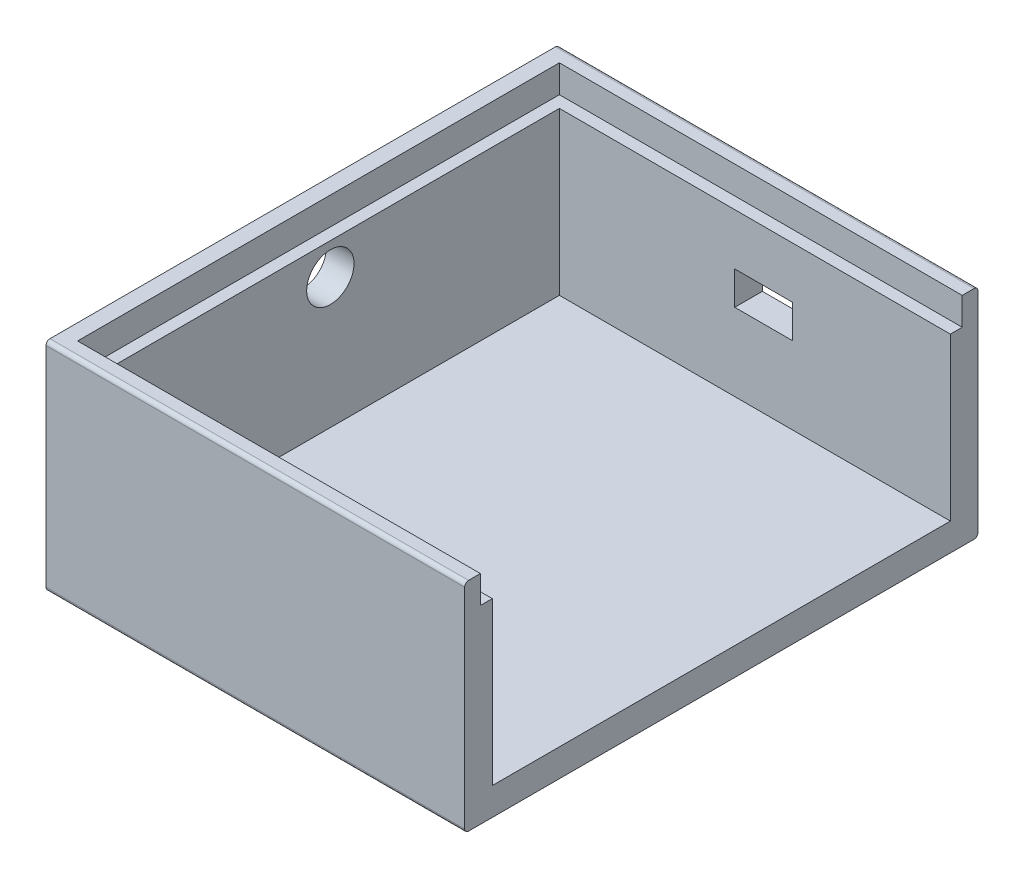
ISO-10303-21;
HEADER;
FILE_DESCRIPTION(('STEP AP214'),'2;1');
FILE_NAME('part.step','',(''),(''),'','','');
FILE_SCHEMA(('AUTOMOTIVE_DESIGN { 1 0 10303 214 1 1 1 1 }'));
ENDSEC;
DATA;
#1=APPLICATION_CONTEXT('core data for automotive mechanical design processes');
#2=APPLICATION_PROTOCOL_DEFINITION('international standard','automotive_design',2000,#1);
#3=PRODUCT_CONTEXT('',#1,'mechanical');
#4=PRODUCT('Part','Part','',(#3));
#5=PRODUCT_RELATED_PRODUCT_CATEGORY('part','',(#4));
#6=PRODUCT_DEFINITION_FORMATION('','',#4);
#7=PRODUCT_DEFINITION_CONTEXT('part definition',#1,'design');
#8=PRODUCT_DEFINITION('design','',#6,#7);
#9=PRODUCT_DEFINITION_SHAPE('','',#8);
#10=(LENGTH_UNIT() NAMED_UNIT(*) SI_UNIT(.MILLI.,.METRE.));
#11=(NAMED_UNIT(*) PLANE_ANGLE_UNIT() SI_UNIT($,.RADIAN.));
#12=(NAMED_UNIT(*) SI_UNIT($,.STERADIAN.) SOLID_ANGLE_UNIT());
#13=UNCERTAINTY_MEASURE_WITH_UNIT(LENGTH_MEASURE(1.E-05),#10,'distance_accuracy_value','');
#14=(GEOMETRIC_REPRESENTATION_CONTEXT(3) GLOBAL_UNCERTAINTY_ASSIGNED_CONTEXT((#13)) GLOBAL_UNIT_ASSIGNED_CONTEXT((#10,
#11,#12)) REPRESENTATION_CONTEXT('',''));
#15=CARTESIAN_POINT('',(0.,0.,0.));
#16=DIRECTION('',(0.,0.,1.));
#17=DIRECTION('',(1.,0.,0.));
#18=AXIS2_PLACEMENT_3D('',#15,#16,#17);
#19=CARTESIAN_POINT('',(106.,0.,1.));
#20=DIRECTION('',(0.,-1.,0.));
#21=DIRECTION('',(0.,0.,-1.));
#22=AXIS2_PLACEMENT_3D('',#19,#20,#21);
#23=PLANE('',#22);
#24=DIRECTION('',(0.,0.,-1.));
#25=VECTOR('',#24,1.);
#26=CARTESIAN_POINT('',(4.,0.,1.));
#27=LINE('',#26,#25);
#28=CARTESIAN_POINT('',(4.,0.,126.));
#29=VERTEX_POINT('',#28);
#30=CARTESIAN_POINT('',(4.,0.,4.));
#31=VERTEX_POINT('',#30);
#32=EDGE_CURVE('E12',#29,#31,#27,.T.);
#33=ORIENTED_EDGE('',*,*,#32,.T.);
#34=DIRECTION('',(1.,0.,0.));
#35=VECTOR('',#34,1.);
#36=CARTESIAN_POINT('',(106.,0.,4.));
#37=LINE('',#36,#35);
#38=CARTESIAN_POINT('',(106.,0.,4.));
#39=VERTEX_POINT('',#38);
#40=EDGE_CURVE('E205',#31,#39,#37,.T.);
#41=ORIENTED_EDGE('',*,*,#40,.T.);
#42=DIRECTION('',(0.,0.,1.));
#43=VECTOR('',#42,1.);
#44=CARTESIAN_POINT('',(106.,0.,1.));
#45=LINE('',#44,#43);
#46=CARTESIAN_POINT('',(106.,0.,1.));
#47=VERTEX_POINT('',#46);
#48=EDGE_CURVE('E279',#47,#39,#45,.T.);
#49=ORIENTED_EDGE('',*,*,#48,.F.);
#50=DIRECTION('',(-1.,0.,0.));
#51=VECTOR('',#50,1.);
#52=CARTESIAN_POINT('',(106.,0.,1.));
#53=LINE('',#52,#51);
#54=CARTESIAN_POINT('',(0.,0.,1.));
#55=VERTEX_POINT('',#54);
#56=EDGE_CURVE('E330',#47,#55,#53,.T.);
#57=ORIENTED_EDGE('',*,*,#56,.T.);
#58=DIRECTION('',(0.,0.,1.));
#59=VECTOR('',#58,1.);
#60=CARTESIAN_POINT('',(0.,0.,1.));
#61=LINE('',#60,#59);
#62=CARTESIAN_POINT('',(0.,0.,129.));
#63=VERTEX_POINT('',#62);
#64=EDGE_CURVE('E297',#55,#63,#61,.T.);
#65=ORIENTED_EDGE('',*,*,#64,.T.);
#66=DIRECTION('',(-1.,0.,0.));
#67=VECTOR('',#66,1.);
#68=CARTESIAN_POINT('',(106.,0.,129.));
#69=LINE('',#68,#67);
#70=CARTESIAN_POINT('',(106.,0.,129.));
#71=VERTEX_POINT('',#70);
#72=EDGE_CURVE('E327',#71,#63,#69,.T.);
#73=ORIENTED_EDGE('',*,*,#72,.F.);
#74=CARTESIAN_POINT('',(106.,0.,126.));
#75=VERTEX_POINT('',#74);
#76=EDGE_CURVE('E277',#75,#71,#45,.T.);
#77=ORIENTED_EDGE('',*,*,#76,.F.);
#78=DIRECTION('',(-1.,0.,0.));
#79=VECTOR('',#78,1.);
#80=CARTESIAN_POINT('',(106.,0.,126.));
#81=LINE('',#80,#79);
#82=EDGE_CURVE('E203',#75,#29,#81,.T.);
#83=ORIENTED_EDGE('',*,*,#82,.T.);
#84=EDGE_LOOP('',(#33,#41,#49,#57,#65,#73,#77,#83));
#85=FACE_BOUND('',#84,.T.);
#86=ADVANCED_FACE('F36',(#85),#23,.F.);
#87=CARTESIAN_POINT('',(106.,-0.999999999999999,1.));
#88=DIRECTION('',(-1.,0.,0.));
#89=DIRECTION('',(0.,0.,1.));
#90=AXIS2_PLACEMENT_3D('',#87,#88,#89);
#91=PLANE('',#90);
#92=ORIENTED_EDGE('',*,*,#48,.T.);
#93=DIRECTION('',(0.,-1.,0.));
#94=VECTOR('',#93,1.);
#95=CARTESIAN_POINT('',(106.,-1.,4.));
#96=LINE('',#95,#94);
#97=CARTESIAN_POINT('',(106.,-7.,4.));
#98=VERTEX_POINT('',#97);
#99=EDGE_CURVE('E44',#39,#98,#96,.T.);
#100=ORIENTED_EDGE('',*,*,#99,.T.);
#101=DIRECTION('',(0.,0.,1.));
#102=VECTOR('',#101,1.);
#103=CARTESIAN_POINT('',(106.,-7.,1.));
#104=LINE('',#103,#102);
#105=CARTESIAN_POINT('',(106.,-7.,7.));
#106=VERTEX_POINT('',#105);
#107=EDGE_CURVE('E202',#98,#106,#104,.T.);
#108=ORIENTED_EDGE('',*,*,#107,.T.);
#109=DIRECTION('',(0.,1.,0.));
#110=VECTOR('',#109,1.);
#111=CARTESIAN_POINT('',(106.,-1.,7.));
#112=LINE('',#111,#110);
#113=CARTESIAN_POINT('',(106.,-48.,6.99999999999999));
#114=VERTEX_POINT('',#113);
#115=EDGE_CURVE('E264',#114,#106,#112,.T.);
#116=ORIENTED_EDGE('',*,*,#115,.F.);
#117=DIRECTION('',(0.,0.,-1.));
#118=VECTOR('',#117,1.);
#119=CARTESIAN_POINT('',(106.,-48.,0.99999999999999));
#120=LINE('',#119,#118);
#121=CARTESIAN_POINT('',(106.,-48.,123.));
#122=VERTEX_POINT('',#121);
#123=EDGE_CURVE('E270',#122,#114,#120,.T.);
#124=ORIENTED_EDGE('',*,*,#123,.F.);
#125=DIRECTION('',(0.,-1.,0.));
#126=VECTOR('',#125,1.);
#127=CARTESIAN_POINT('',(106.,-1.00000000000006,123.));
#128=LINE('',#127,#126);
#129=CARTESIAN_POINT('',(106.,-7.00000000000001,123.));
#130=VERTEX_POINT('',#129);
#131=EDGE_CURVE('E267',#130,#122,#128,.T.);
#132=ORIENTED_EDGE('',*,*,#131,.F.);
#133=CARTESIAN_POINT('',(106.,-7.00000000000002,126.));
#134=VERTEX_POINT('',#133);
#135=EDGE_CURVE('E199',#130,#134,#104,.T.);
#136=ORIENTED_EDGE('',*,*,#135,.T.);
#137=DIRECTION('',(0.,1.,0.));
#138=VECTOR('',#137,1.);
#139=CARTESIAN_POINT('',(106.,-1.00000000000001,126.));
#140=LINE('',#139,#138);
#141=EDGE_CURVE('E190',#134,#75,#140,.T.);
#142=ORIENTED_EDGE('',*,*,#141,.T.);
#143=ORIENTED_EDGE('',*,*,#76,.T.);
#144=CARTESIAN_POINT('',(106.,-1.00000000000001,129.));
#145=DIRECTION('',(1.,0.,0.));
#146=DIRECTION('',(0.,0.,-1.));
#147=AXIS2_PLACEMENT_3D('',#144,#145,#146);
#148=CIRCLE('',#147,1.);
#149=CARTESIAN_POINT('',(106.,-1.00000000000001,130.));
#150=VERTEX_POINT('',#149);
#151=EDGE_CURVE('E282',#71,#150,#148,.T.);
#152=ORIENTED_EDGE('',*,*,#151,.T.);
#153=DIRECTION('',(0.,-1.,0.));
#154=VECTOR('',#153,1.);
#155=CARTESIAN_POINT('',(106.,-1.00000000000001,130.));
#156=LINE('',#155,#154);
#157=CARTESIAN_POINT('',(106.,-54.,130.));
#158=VERTEX_POINT('',#157);
#159=EDGE_CURVE('E284',#150,#158,#156,.T.);
#160=ORIENTED_EDGE('',*,*,#159,.T.);
#161=CARTESIAN_POINT('',(106.,-54.,129.));
#162=DIRECTION('',(1.,0.,0.));
#163=DIRECTION('',(0.,0.,1.));
#164=AXIS2_PLACEMENT_3D('',#161,#162,#163);
#165=CIRCLE('',#164,0.99999999999999);
#166=CARTESIAN_POINT('',(106.,-55.,129.));
#167=VERTEX_POINT('',#166);
#168=EDGE_CURVE('E286',#158,#167,#165,.T.);
#169=ORIENTED_EDGE('',*,*,#168,.T.);
#170=DIRECTION('',(0.,0.,-1.));
#171=VECTOR('',#170,1.);
#172=CARTESIAN_POINT('',(106.,-55.,0.999999999999996));
#173=LINE('',#172,#171);
#174=CARTESIAN_POINT('',(106.,-55.,0.999999999999996));
#175=VERTEX_POINT('',#174);
#176=EDGE_CURVE('E288',#167,#175,#173,.T.);
#177=ORIENTED_EDGE('',*,*,#176,.T.);
#178=CARTESIAN_POINT('',(106.,-54.,0.999999999999996));
#179=DIRECTION('',(1.,0.,0.));
#180=DIRECTION('',(0.,0.,1.));
#181=AXIS2_PLACEMENT_3D('',#178,#179,#180);
#182=CIRCLE('',#181,0.999999999999994);
#183=CARTESIAN_POINT('',(106.,-54.,0.));
#184=VERTEX_POINT('',#183);
#185=EDGE_CURVE('E290',#175,#184,#182,.T.);
#186=ORIENTED_EDGE('',*,*,#185,.T.);
#187=DIRECTION('',(0.,1.,0.));
#188=VECTOR('',#187,1.);
#189=CARTESIAN_POINT('',(106.,-0.999999999999999,0.));
#190=LINE('',#189,#188);
#191=CARTESIAN_POINT('',(106.,-0.999999999999999,0.));
#192=VERTEX_POINT('',#191);
#193=EDGE_CURVE('E292',#184,#192,#190,.T.);
#194=ORIENTED_EDGE('',*,*,#193,.T.);
#195=CARTESIAN_POINT('',(106.,-0.999999999999999,1.));
#196=DIRECTION('',(1.,0.,0.));
#197=DIRECTION('',(0.,0.,1.));
#198=AXIS2_PLACEMENT_3D('',#195,#196,#197);
#199=CIRCLE('',#198,1.);
#200=EDGE_CURVE('E274',#192,#47,#199,.T.);
#201=ORIENTED_EDGE('',*,*,#200,.T.);
#202=EDGE_LOOP('',(#92,#100,#108,#116,#124,#132,#136,#142,#143,#152,#160,#169,#177,#186,#194,#201));
#203=FACE_BOUND('',#202,.T.);
#204=ADVANCED_FACE('F336',(#203),#91,.F.);
#205=CARTESIAN_POINT('',(106.,-0.999999999999999,1.));
#206=DIRECTION('',(-1.,0.,0.));
#207=DIRECTION('',(0.,0.,1.));
#208=AXIS2_PLACEMENT_3D('',#205,#206,#207);
#209=CYLINDRICAL_SURFACE('',#208,1.);
#210=CARTESIAN_POINT('',(0.,-0.999999999999999,1.));
#211=DIRECTION('',(1.,0.,0.));
#212=DIRECTION('',(0.,0.,1.));
#213=AXIS2_PLACEMENT_3D('',#210,#211,#212);
#214=CIRCLE('',#213,1.);
#215=CARTESIAN_POINT('',(0.,-0.999999999999999,0.));
#216=VERTEX_POINT('',#215);
#217=EDGE_CURVE('E252',#216,#55,#214,.T.);
#218=ORIENTED_EDGE('',*,*,#217,.T.);
#219=ORIENTED_EDGE('',*,*,#56,.F.);
#220=ORIENTED_EDGE('',*,*,#200,.F.);
#221=DIRECTION('',(-1.,0.,0.));
#222=VECTOR('',#221,1.);
#223=CARTESIAN_POINT('',(106.,-0.999999999999999,0.));
#224=LINE('',#223,#222);
#225=EDGE_CURVE('E294',#192,#216,#224,.T.);
#226=ORIENTED_EDGE('',*,*,#225,.T.);
#227=EDGE_LOOP('',(#218,#219,#220,#226));
#228=FACE_BOUND('',#227,.T.);
#229=ADVANCED_FACE('F38',(#228),#209,.T.);
#230=CARTESIAN_POINT('',(106.,-1.00000000000001,129.));
#231=DIRECTION('',(-1.,0.,0.));
#232=DIRECTION('',(0.,0.,1.));
#233=AXIS2_PLACEMENT_3D('',#230,#231,#232);
#234=CYLINDRICAL_SURFACE('',#233,1.);
#235=CARTESIAN_POINT('',(0.,-1.00000000000001,129.));
#236=DIRECTION('',(1.,0.,0.));
#237=DIRECTION('',(0.,0.,-1.));
#238=AXIS2_PLACEMENT_3D('',#235,#236,#237);
#239=CIRCLE('',#238,1.);
#240=CARTESIAN_POINT('',(0.,-1.00000000000001,130.));
#241=VERTEX_POINT('',#240);
#242=EDGE_CURVE('E299',#63,#241,#239,.T.);
#243=ORIENTED_EDGE('',*,*,#242,.T.);
#244=DIRECTION('',(-1.,0.,0.));
#245=VECTOR('',#244,1.);
#246=CARTESIAN_POINT('',(106.,-1.00000000000001,130.));
#247=LINE('',#246,#245);
#248=EDGE_CURVE('E324',#150,#241,#247,.T.);
#249=ORIENTED_EDGE('',*,*,#248,.F.);
#250=ORIENTED_EDGE('',*,*,#151,.F.);
#251=ORIENTED_EDGE('',*,*,#72,.T.);
#252=EDGE_LOOP('',(#243,#249,#250,#251));
#253=FACE_BOUND('',#252,.T.);
#254=ADVANCED_FACE('F372',(#253),#234,.T.);
#255=CARTESIAN_POINT('',(106.,-1.00000000000001,130.));
#256=DIRECTION('',(0.,0.,-1.));
#257=DIRECTION('',(0.,1.,0.));
#258=AXIS2_PLACEMENT_3D('',#255,#256,#257);
#259=PLANE('',#258);
#260=DIRECTION('',(0.,-1.,0.));
#261=VECTOR('',#260,1.);
#262=CARTESIAN_POINT('',(0.,-1.00000000000001,130.));
#263=LINE('',#262,#261);
#264=CARTESIAN_POINT('',(0.,-54.,130.));
#265=VERTEX_POINT('',#264);
#266=EDGE_CURVE('E301',#241,#265,#263,.T.);
#267=ORIENTED_EDGE('',*,*,#266,.T.);
#268=DIRECTION('',(-1.,0.,0.));
#269=VECTOR('',#268,1.);
#270=CARTESIAN_POINT('',(106.,-54.,130.));
#271=LINE('',#270,#269);
#272=EDGE_CURVE('E321',#158,#265,#271,.T.);
#273=ORIENTED_EDGE('',*,*,#272,.F.);
#274=ORIENTED_EDGE('',*,*,#159,.F.);
#275=ORIENTED_EDGE('',*,*,#248,.T.);
#276=EDGE_LOOP('',(#267,#273,#274,#275));
#277=FACE_BOUND('',#276,.T.);
#278=ADVANCED_FACE('F375',(#277),#259,.F.);
#279=CARTESIAN_POINT('',(106.,-54.,129.));
#280=DIRECTION('',(-1.,0.,0.));
#281=DIRECTION('',(0.,0.,1.));
#282=AXIS2_PLACEMENT_3D('',#279,#280,#281);
#283=CYLINDRICAL_SURFACE('',#282,0.99999999999999);
#284=CARTESIAN_POINT('',(0.,-54.,129.));
#285=DIRECTION('',(1.,0.,0.));
#286=DIRECTION('',(0.,0.,1.));
#287=AXIS2_PLACEMENT_3D('',#284,#285,#286);
#288=CIRCLE('',#287,0.99999999999999);
#289=CARTESIAN_POINT('',(0.,-55.,129.));
#290=VERTEX_POINT('',#289);
#291=EDGE_CURVE('E303',#265,#290,#288,.T.);
#292=ORIENTED_EDGE('',*,*,#291,.T.);
#293=DIRECTION('',(-1.,0.,0.));
#294=VECTOR('',#293,1.);
#295=CARTESIAN_POINT('',(106.,-55.,129.));
#296=LINE('',#295,#294);
#297=EDGE_CURVE('E318',#167,#290,#296,.T.);
#298=ORIENTED_EDGE('',*,*,#297,.F.);
#299=ORIENTED_EDGE('',*,*,#168,.F.);
#300=ORIENTED_EDGE('',*,*,#272,.T.);
#301=EDGE_LOOP('',(#292,#298,#299,#300));
#302=FACE_BOUND('',#301,.T.);
#303=ADVANCED_FACE('F379',(#302),#283,.T.);
#304=CARTESIAN_POINT('',(106.,-55.,0.999999999999996));
#305=DIRECTION('',(0.,1.,0.));
#306=DIRECTION('',(0.,0.,1.));
#307=AXIS2_PLACEMENT_3D('',#304,#305,#306);
#308=PLANE('',#307);
#309=DIRECTION('',(0.,0.,-1.));
#310=VECTOR('',#309,1.);
#311=CARTESIAN_POINT('',(0.,-55.,0.999999999999996));
#312=LINE('',#311,#310);
#313=CARTESIAN_POINT('',(0.,-55.,0.999999999999996));
#314=VERTEX_POINT('',#313);
#315=EDGE_CURVE('E305',#290,#314,#312,.T.);
#316=ORIENTED_EDGE('',*,*,#315,.T.);
#317=DIRECTION('',(-1.,0.,0.));
#318=VECTOR('',#317,1.);
#319=CARTESIAN_POINT('',(106.,-55.,0.999999999999996));
#320=LINE('',#319,#318);
#321=EDGE_CURVE('E315',#175,#314,#320,.T.);
#322=ORIENTED_EDGE('',*,*,#321,.F.);
#323=ORIENTED_EDGE('',*,*,#176,.F.);
#324=ORIENTED_EDGE('',*,*,#297,.T.);
#325=EDGE_LOOP('',(#316,#322,#323,#324));
#326=FACE_BOUND('',#325,.T.);
#327=ADVANCED_FACE('F383',(#326),#308,.F.);
#328=CARTESIAN_POINT('',(106.,-54.,0.999999999999996));
#329=DIRECTION('',(-1.,0.,0.));
#330=DIRECTION('',(0.,0.,1.));
#331=AXIS2_PLACEMENT_3D('',#328,#329,#330);
#332=CYLINDRICAL_SURFACE('',#331,0.999999999999994);
#333=CARTESIAN_POINT('',(0.,-54.,0.999999999999996));
#334=DIRECTION('',(1.,0.,0.));
#335=DIRECTION('',(0.,0.,1.));
#336=AXIS2_PLACEMENT_3D('',#333,#334,#335);
#337=CIRCLE('',#336,0.999999999999994);
#338=CARTESIAN_POINT('',(0.,-54.,0.));
#339=VERTEX_POINT('',#338);
#340=EDGE_CURVE('E307',#314,#339,#337,.T.);
#341=ORIENTED_EDGE('',*,*,#340,.T.);
#342=DIRECTION('',(-1.,0.,0.));
#343=VECTOR('',#342,1.);
#344=CARTESIAN_POINT('',(106.,-54.,0.));
#345=LINE('',#344,#343);
#346=EDGE_CURVE('E312',#184,#339,#345,.T.);
#347=ORIENTED_EDGE('',*,*,#346,.F.);
#348=ORIENTED_EDGE('',*,*,#185,.F.);
#349=ORIENTED_EDGE('',*,*,#321,.T.);
#350=EDGE_LOOP('',(#341,#347,#348,#349));
#351=FACE_BOUND('',#350,.T.);
#352=ADVANCED_FACE('F387',(#351),#332,.T.);
#353=CARTESIAN_POINT('',(106.,-0.999999999999999,0.));
#354=DIRECTION('',(0.,0.,1.));
#355=DIRECTION('',(0.,-1.,0.));
#356=AXIS2_PLACEMENT_3D('',#353,#354,#355);
#357=PLANE('',#356);
#358=DIRECTION('',(0.,1.,0.));
#359=VECTOR('',#358,1.);
#360=CARTESIAN_POINT('',(51.4,-20.,0.));
#361=LINE('',#360,#359);
#362=CARTESIAN_POINT('',(51.4,-28.42,0.));
#363=VERTEX_POINT('',#362);
#364=CARTESIAN_POINT('',(51.4,-20.,0.));
#365=VERTEX_POINT('',#364);
#366=EDGE_CURVE('E217',#363,#365,#361,.T.);
#367=ORIENTED_EDGE('',*,*,#366,.F.);
#368=DIRECTION('',(-1.,0.,0.));
#369=VECTOR('',#368,1.);
#370=CARTESIAN_POINT('',(66.,-28.42,0.));
#371=LINE('',#370,#369);
#372=CARTESIAN_POINT('',(66.,-28.42,0.));
#373=VERTEX_POINT('',#372);
#374=EDGE_CURVE('E220',#373,#363,#371,.T.);
#375=ORIENTED_EDGE('',*,*,#374,.F.);
#376=DIRECTION('',(0.,-1.,0.));
#377=VECTOR('',#376,1.);
#378=CARTESIAN_POINT('',(66.,-20.,0.));
#379=LINE('',#378,#377);
#380=CARTESIAN_POINT('',(66.,-20.,0.));
#381=VERTEX_POINT('',#380);
#382=EDGE_CURVE('E214',#381,#373,#379,.T.);
#383=ORIENTED_EDGE('',*,*,#382,.F.);
#384=DIRECTION('',(1.,0.,0.));
#385=VECTOR('',#384,1.);
#386=CARTESIAN_POINT('',(66.,-20.,0.));
#387=LINE('',#386,#385);
#388=EDGE_CURVE('E51',#365,#381,#387,.T.);
#389=ORIENTED_EDGE('',*,*,#388,.F.);
#390=EDGE_LOOP('',(#367,#375,#383,#389));
#391=FACE_BOUND('',#390,.T.);
#392=DIRECTION('',(0.,1.,0.));
#393=VECTOR('',#392,1.);
#394=CARTESIAN_POINT('',(0.,-0.999999999999999,0.));
#395=LINE('',#394,#393);
#396=EDGE_CURVE('E278',#339,#216,#395,.T.);
#397=ORIENTED_EDGE('',*,*,#396,.T.);
#398=ORIENTED_EDGE('',*,*,#225,.F.);
#399=ORIENTED_EDGE('',*,*,#193,.F.);
#400=ORIENTED_EDGE('',*,*,#346,.T.);
#401=EDGE_LOOP('',(#397,#398,#399,#400));
#402=FACE_BOUND('',#401,.T.);
#403=ADVANCED_FACE('F391',(#391,#402),#357,.F.);
#404=CARTESIAN_POINT('',(0.,-0.999999999999999,1.));
#405=DIRECTION('',(-1.,0.,0.));
#406=DIRECTION('',(0.,0.,1.));
#407=AXIS2_PLACEMENT_3D('',#404,#405,#406);
#408=PLANE('',#407);
#409=CARTESIAN_POINT('',(0.,-15.,65.));
#410=DIRECTION('',(-1.,0.,0.));
#411=DIRECTION('',(0.,0.,1.));
#412=AXIS2_PLACEMENT_3D('',#409,#410,#411);
#413=CIRCLE('',#412,6.);
#414=CARTESIAN_POINT('',(0.,-15.,71.));
#415=VERTEX_POINT('',#414);
#416=EDGE_CURVE('E208',#415,#415,#413,.T.);
#417=ORIENTED_EDGE('',*,*,#416,.F.);
#418=EDGE_LOOP('',(#417));
#419=FACE_BOUND('',#418,.T.);
#420=ORIENTED_EDGE('',*,*,#217,.F.);
#421=ORIENTED_EDGE('',*,*,#396,.F.);
#422=ORIENTED_EDGE('',*,*,#340,.F.);
#423=ORIENTED_EDGE('',*,*,#315,.F.);
#424=ORIENTED_EDGE('',*,*,#291,.F.);
#425=ORIENTED_EDGE('',*,*,#266,.F.);
#426=ORIENTED_EDGE('',*,*,#242,.F.);
#427=ORIENTED_EDGE('',*,*,#64,.F.);
#428=EDGE_LOOP('',(#420,#421,#422,#423,#424,#425,#426,#427));
#429=FACE_BOUND('',#428,.T.);
#430=ADVANCED_FACE('F364',(#419,#429),#408,.T.);
#431=CARTESIAN_POINT('',(106.,-1.00000000000001,123.));
#432=DIRECTION('',(0.,0.,-1.));
#433=DIRECTION('',(0.,1.,0.));
#434=AXIS2_PLACEMENT_3D('',#431,#432,#433);
#435=PLANE('',#434);
#436=DIRECTION('',(0.,-1.,0.));
#437=VECTOR('',#436,1.);
#438=CARTESIAN_POINT('',(7.,-1.00000000000006,123.));
#439=LINE('',#438,#437);
#440=CARTESIAN_POINT('',(7.,-7.00000000000001,123.));
#441=VERTEX_POINT('',#440);
#442=CARTESIAN_POINT('',(7.,-48.,123.));
#443=VERTEX_POINT('',#442);
#444=EDGE_CURVE('E245',#441,#443,#439,.T.);
#445=ORIENTED_EDGE('',*,*,#444,.F.);
#446=DIRECTION('',(-1.,0.,0.));
#447=VECTOR('',#446,1.);
#448=CARTESIAN_POINT('',(106.,-7.00000000000001,123.));
#449=LINE('',#448,#447);
#450=EDGE_CURVE('E246',#130,#441,#449,.T.);
#451=ORIENTED_EDGE('',*,*,#450,.F.);
#452=ORIENTED_EDGE('',*,*,#131,.T.);
#453=DIRECTION('',(-1.,0.,0.));
#454=VECTOR('',#453,1.);
#455=CARTESIAN_POINT('',(106.,-48.,123.));
#456=LINE('',#455,#454);
#457=EDGE_CURVE('E249',#122,#443,#456,.T.);
#458=ORIENTED_EDGE('',*,*,#457,.T.);
#459=EDGE_LOOP('',(#445,#451,#452,#458));
#460=FACE_BOUND('',#459,.T.);
#461=ADVANCED_FACE('F348',(#460),#435,.T.);
#462=CARTESIAN_POINT('',(106.,-48.,0.999999999999998));
#463=DIRECTION('',(0.,1.,0.));
#464=DIRECTION('',(0.,0.,1.));
#465=AXIS2_PLACEMENT_3D('',#462,#463,#464);
#466=PLANE('',#465);
#467=DIRECTION('',(0.,0.,-1.));
#468=VECTOR('',#467,1.);
#469=CARTESIAN_POINT('',(7.,-48.,0.99999999999999));
#470=LINE('',#469,#468);
#471=CARTESIAN_POINT('',(7.,-48.,6.99999999999999));
#472=VERTEX_POINT('',#471);
#473=EDGE_CURVE('E255',#443,#472,#470,.T.);
#474=ORIENTED_EDGE('',*,*,#473,.F.);
#475=ORIENTED_EDGE('',*,*,#457,.F.);
#476=ORIENTED_EDGE('',*,*,#123,.T.);
#477=DIRECTION('',(-1.,0.,0.));
#478=VECTOR('',#477,1.);
#479=CARTESIAN_POINT('',(106.,-48.,6.99999999999999));
#480=LINE('',#479,#478);
#481=EDGE_CURVE('E258',#114,#472,#480,.T.);
#482=ORIENTED_EDGE('',*,*,#481,.T.);
#483=EDGE_LOOP('',(#474,#475,#476,#482));
#484=FACE_BOUND('',#483,.T.);
#485=ADVANCED_FACE('F355',(#484),#466,.T.);
#486=CARTESIAN_POINT('',(106.,-1.,7.));
#487=DIRECTION('',(0.,0.,1.));
#488=DIRECTION('',(0.,-1.,0.));
#489=AXIS2_PLACEMENT_3D('',#486,#487,#488);
#490=PLANE('',#489);
#491=DIRECTION('',(-1.,0.,0.));
#492=VECTOR('',#491,1.);
#493=CARTESIAN_POINT('',(66.,-28.42,7.));
#494=LINE('',#493,#492);
#495=CARTESIAN_POINT('',(66.,-28.42,7.));
#496=VERTEX_POINT('',#495);
#497=CARTESIAN_POINT('',(51.4,-28.42,7.));
#498=VERTEX_POINT('',#497);
#499=EDGE_CURVE('E216',#496,#498,#494,.T.);
#500=ORIENTED_EDGE('',*,*,#499,.T.);
#501=DIRECTION('',(0.,1.,0.));
#502=VECTOR('',#501,1.);
#503=CARTESIAN_POINT('',(51.4,-20.,7.));
#504=LINE('',#503,#502);
#505=CARTESIAN_POINT('',(51.4,-20.,7.));
#506=VERTEX_POINT('',#505);
#507=EDGE_CURVE('E235',#498,#506,#504,.T.);
#508=ORIENTED_EDGE('',*,*,#507,.T.);
#509=DIRECTION('',(1.,0.,0.));
#510=VECTOR('',#509,1.);
#511=CARTESIAN_POINT('',(66.,-20.,7.));
#512=LINE('',#511,#510);
#513=CARTESIAN_POINT('',(66.,-20.,7.));
#514=VERTEX_POINT('',#513);
#515=EDGE_CURVE('E231',#506,#514,#512,.T.);
#516=ORIENTED_EDGE('',*,*,#515,.T.);
#517=DIRECTION('',(0.,-1.,0.));
#518=VECTOR('',#517,1.);
#519=CARTESIAN_POINT('',(66.,-20.,7.));
#520=LINE('',#519,#518);
#521=EDGE_CURVE('E227',#514,#496,#520,.T.);
#522=ORIENTED_EDGE('',*,*,#521,.T.);
#523=EDGE_LOOP('',(#500,#508,#516,#522));
#524=FACE_BOUND('',#523,.T.);
#525=DIRECTION('',(0.,1.,0.));
#526=VECTOR('',#525,1.);
#527=CARTESIAN_POINT('',(7.,-1.,7.));
#528=LINE('',#527,#526);
#529=CARTESIAN_POINT('',(7.,-7.,6.99999999999999));
#530=VERTEX_POINT('',#529);
#531=EDGE_CURVE('E261',#472,#530,#528,.T.);
#532=ORIENTED_EDGE('',*,*,#531,.F.);
#533=ORIENTED_EDGE('',*,*,#481,.F.);
#534=ORIENTED_EDGE('',*,*,#115,.T.);
#535=DIRECTION('',(-1.,0.,0.));
#536=VECTOR('',#535,1.);
#537=CARTESIAN_POINT('',(106.,-7.,7.));
#538=LINE('',#537,#536);
#539=EDGE_CURVE('E248',#106,#530,#538,.T.);
#540=ORIENTED_EDGE('',*,*,#539,.T.);
#541=EDGE_LOOP('',(#532,#533,#534,#540));
#542=FACE_BOUND('',#541,.T.);
#543=ADVANCED_FACE('F352',(#524,#542),#490,.T.);
#544=CARTESIAN_POINT('',(7.,-0.999999999999999,1.));
#545=DIRECTION('',(-1.,0.,0.));
#546=DIRECTION('',(0.,0.,1.));
#547=AXIS2_PLACEMENT_3D('',#544,#545,#546);
#548=PLANE('',#547);
#549=CARTESIAN_POINT('',(7.,-15.,65.));
#550=DIRECTION('',(-1.,0.,0.));
#551=DIRECTION('',(0.,0.,1.));
#552=AXIS2_PLACEMENT_3D('',#549,#550,#551);
#553=CIRCLE('',#552,6.);
#554=CARTESIAN_POINT('',(7.,-15.,71.));
#555=VERTEX_POINT('',#554);
#556=EDGE_CURVE('E211',#555,#555,#553,.F.);
#557=ORIENTED_EDGE('',*,*,#556,.F.);
#558=EDGE_LOOP('',(#557));
#559=FACE_BOUND('',#558,.T.);
#560=DIRECTION('',(0.,0.,1.));
#561=VECTOR('',#560,1.);
#562=CARTESIAN_POINT('',(7.,-7.,1.));
#563=LINE('',#562,#561);
#564=EDGE_CURVE('E242',#530,#441,#563,.T.);
#565=ORIENTED_EDGE('',*,*,#564,.T.);
#566=ORIENTED_EDGE('',*,*,#444,.T.);
#567=ORIENTED_EDGE('',*,*,#473,.T.);
#568=ORIENTED_EDGE('',*,*,#531,.T.);
#569=EDGE_LOOP('',(#565,#566,#567,#568));
#570=FACE_BOUND('',#569,.T.);
#571=ADVANCED_FACE('F350',(#559,#570),#548,.F.);
#572=CARTESIAN_POINT('',(66.,-28.42,23.8539728254201));
#573=DIRECTION('',(0.,-1.,0.));
#574=DIRECTION('',(1.,0.,0.));
#575=AXIS2_PLACEMENT_3D('',#572,#573,#574);
#576=PLANE('',#575);
#577=DIRECTION('',(0.,0.,-1.));
#578=VECTOR('',#577,1.);
#579=CARTESIAN_POINT('',(66.,-28.42,23.8539728254201));
#580=LINE('',#579,#578);
#581=EDGE_CURVE('E59',#496,#373,#580,.T.);
#582=ORIENTED_EDGE('',*,*,#581,.T.);
#583=ORIENTED_EDGE('',*,*,#374,.T.);
#584=DIRECTION('',(0.,0.,-1.));
#585=VECTOR('',#584,1.);
#586=CARTESIAN_POINT('',(51.4,-28.42,23.8539728254201));
#587=LINE('',#586,#585);
#588=EDGE_CURVE('E226',#498,#363,#587,.T.);
#589=ORIENTED_EDGE('',*,*,#588,.F.);
#590=ORIENTED_EDGE('',*,*,#499,.F.);
#591=EDGE_LOOP('',(#582,#583,#589,#590));
#592=FACE_BOUND('',#591,.T.);
#593=ADVANCED_FACE('F400',(#592),#576,.F.);
#594=CARTESIAN_POINT('',(51.4,-20.,23.8539728254201));
#595=DIRECTION('',(-1.,0.,0.));
#596=DIRECTION('',(0.,0.,1.));
#597=AXIS2_PLACEMENT_3D('',#594,#595,#596);
#598=PLANE('',#597);
#599=ORIENTED_EDGE('',*,*,#588,.T.);
#600=ORIENTED_EDGE('',*,*,#366,.T.);
#601=DIRECTION('',(0.,0.,-1.));
#602=VECTOR('',#601,1.);
#603=CARTESIAN_POINT('',(51.4,-20.,23.8539728254201));
#604=LINE('',#603,#602);
#605=EDGE_CURVE('E234',#506,#365,#604,.T.);
#606=ORIENTED_EDGE('',*,*,#605,.F.);
#607=ORIENTED_EDGE('',*,*,#507,.F.);
#608=EDGE_LOOP('',(#599,#600,#606,#607));
#609=FACE_BOUND('',#608,.T.);
#610=ADVANCED_FACE('F405',(#609),#598,.F.);
#611=CARTESIAN_POINT('',(66.,-20.,23.8539728254201));
#612=DIRECTION('',(0.,1.,0.));
#613=DIRECTION('',(0.,0.,1.));
#614=AXIS2_PLACEMENT_3D('',#611,#612,#613);
#615=PLANE('',#614);
#616=ORIENTED_EDGE('',*,*,#605,.T.);
#617=ORIENTED_EDGE('',*,*,#388,.T.);
#618=DIRECTION('',(0.,0.,-1.));
#619=VECTOR('',#618,1.);
#620=CARTESIAN_POINT('',(66.,-20.,23.8539728254201));
#621=LINE('',#620,#619);
#622=EDGE_CURVE('E230',#514,#381,#621,.T.);
#623=ORIENTED_EDGE('',*,*,#622,.F.);
#624=ORIENTED_EDGE('',*,*,#515,.F.);
#625=EDGE_LOOP('',(#616,#617,#623,#624));
#626=FACE_BOUND('',#625,.T.);
#627=ADVANCED_FACE('F534',(#626),#615,.F.);
#628=CARTESIAN_POINT('',(66.,-20.,23.8539728254201));
#629=DIRECTION('',(1.,0.,0.));
#630=DIRECTION('',(0.,0.,-1.));
#631=AXIS2_PLACEMENT_3D('',#628,#629,#630);
#632=PLANE('',#631);
#633=ORIENTED_EDGE('',*,*,#622,.T.);
#634=ORIENTED_EDGE('',*,*,#382,.T.);
#635=ORIENTED_EDGE('',*,*,#581,.F.);
#636=ORIENTED_EDGE('',*,*,#521,.F.);
#637=EDGE_LOOP('',(#633,#634,#635,#636));
#638=FACE_BOUND('',#637,.T.);
#639=ADVANCED_FACE('F413',(#638),#632,.F.);
#640=CARTESIAN_POINT('',(23.9705627484771,-15.,65.));
#641=DIRECTION('',(-1.,0.,0.));
#642=DIRECTION('',(0.,0.,1.));
#643=AXIS2_PLACEMENT_3D('',#640,#641,#642);
#644=CYLINDRICAL_SURFACE('',#643,6.);
#645=ORIENTED_EDGE('',*,*,#556,.T.);
#646=EDGE_LOOP('',(#645));
#647=FACE_BOUND('',#646,.T.);
#648=ORIENTED_EDGE('',*,*,#416,.T.);
#649=EDGE_LOOP('',(#648));
#650=FACE_BOUND('',#649,.T.);
#651=ADVANCED_FACE('F410',(#647,#650),#644,.F.);
#652=CARTESIAN_POINT('',(4.,20.,126.));
#653=DIRECTION('',(-1.,0.,0.));
#654=DIRECTION('',(0.,0.,1.));
#655=AXIS2_PLACEMENT_3D('',#652,#653,#654);
#656=PLANE('',#655);
#657=DIRECTION('',(0.,-1.,0.));
#658=VECTOR('',#657,1.);
#659=CARTESIAN_POINT('',(4.,20.,126.));
#660=LINE('',#659,#658);
#661=CARTESIAN_POINT('',(4.,-7.00000000000002,126.));
#662=VERTEX_POINT('',#661);
#663=EDGE_CURVE('E174',#29,#662,#660,.T.);
#664=ORIENTED_EDGE('',*,*,#663,.T.);
#665=DIRECTION('',(0.,0.,-1.));
#666=VECTOR('',#665,1.);
#667=CARTESIAN_POINT('',(4.,-7.00000000000002,126.));
#668=LINE('',#667,#666);
#669=CARTESIAN_POINT('',(4.,-7.,4.));
#670=VERTEX_POINT('',#669);
#671=EDGE_CURVE('E179',#662,#670,#668,.T.);
#672=ORIENTED_EDGE('',*,*,#671,.T.);
#673=DIRECTION('',(0.,-1.,0.));
#674=VECTOR('',#673,1.);
#675=CARTESIAN_POINT('',(4.,20.,4.));
#676=LINE('',#675,#674);
#677=EDGE_CURVE('E183',#31,#670,#676,.T.);
#678=ORIENTED_EDGE('',*,*,#677,.F.);
#679=ORIENTED_EDGE('',*,*,#32,.F.);
#680=EDGE_LOOP('',(#664,#672,#678,#679));
#681=FACE_BOUND('',#680,.T.);
#682=ADVANCED_FACE('F176',(#681),#656,.F.);
#683=CARTESIAN_POINT('',(4.,20.,4.));
#684=DIRECTION('',(0.,0.,-1.));
#685=DIRECTION('',(0.,1.,0.));
#686=AXIS2_PLACEMENT_3D('',#683,#684,#685);
#687=PLANE('',#686);
#688=ORIENTED_EDGE('',*,*,#677,.T.);
#689=DIRECTION('',(1.,0.,0.));
#690=VECTOR('',#689,1.);
#691=CARTESIAN_POINT('',(4.,-7.,4.));
#692=LINE('',#691,#690);
#693=EDGE_CURVE('E184',#670,#98,#692,.T.);
#694=ORIENTED_EDGE('',*,*,#693,.T.);
#695=ORIENTED_EDGE('',*,*,#99,.F.);
#696=ORIENTED_EDGE('',*,*,#40,.F.);
#697=EDGE_LOOP('',(#688,#694,#695,#696));
#698=FACE_BOUND('',#697,.T.);
#699=ADVANCED_FACE('F339',(#698),#687,.F.);
#700=CARTESIAN_POINT('',(109.,20.,126.));
#701=DIRECTION('',(0.,0.,1.));
#702=DIRECTION('',(0.,-1.,0.));
#703=AXIS2_PLACEMENT_3D('',#700,#701,#702);
#704=PLANE('',#703);
#705=ORIENTED_EDGE('',*,*,#141,.F.);
#706=DIRECTION('',(-1.,0.,0.));
#707=VECTOR('',#706,1.);
#708=CARTESIAN_POINT('',(109.,-7.00000000000002,126.));
#709=LINE('',#708,#707);
#710=EDGE_CURVE('E187',#134,#662,#709,.T.);
#711=ORIENTED_EDGE('',*,*,#710,.T.);
#712=ORIENTED_EDGE('',*,*,#663,.F.);
#713=ORIENTED_EDGE('',*,*,#82,.F.);
#714=EDGE_LOOP('',(#705,#711,#712,#713));
#715=FACE_BOUND('',#714,.T.);
#716=ADVANCED_FACE('F188',(#715),#704,.F.);
#717=CARTESIAN_POINT('',(0.,-7.,0.));
#718=DIRECTION('',(0.,-1.,0.));
#719=DIRECTION('',(0.,0.,-1.));
#720=AXIS2_PLACEMENT_3D('',#717,#718,#719);
#721=PLANE('',#720);
#722=ORIENTED_EDGE('',*,*,#693,.F.);
#723=ORIENTED_EDGE('',*,*,#671,.F.);
#724=ORIENTED_EDGE('',*,*,#710,.F.);
#725=ORIENTED_EDGE('',*,*,#135,.F.);
#726=ORIENTED_EDGE('',*,*,#450,.T.);
#727=ORIENTED_EDGE('',*,*,#564,.F.);
#728=ORIENTED_EDGE('',*,*,#539,.F.);
#729=ORIENTED_EDGE('',*,*,#107,.F.);
#730=EDGE_LOOP('',(#722,#723,#724,#725,#726,#727,#728,#729));
#731=FACE_BOUND('',#730,.T.);
#732=ADVANCED_FACE('F194',(#731),#721,.F.);
#733=CLOSED_SHELL('',(#86,#204,#229,#254,#278,#303,#327,#352,#403,#430,#461,#485,#543,#571,#593,
#610,#627,#639,#651,#682,#699,#716,#732));
#734=MANIFOLD_SOLID_BREP('B2',#733);
#735=ADVANCED_BREP_SHAPE_REPRESENTATION('',(#18,#734),#14);
#736=SHAPE_DEFINITION_REPRESENTATION(#9,#735);
ENDSEC;
END-ISO-10303-21;
